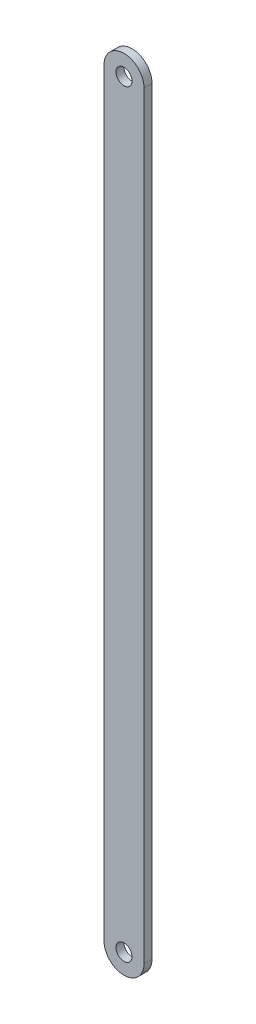
ISO-10303-21;
HEADER;
FILE_DESCRIPTION(('STEP AP214'),'2;1');
FILE_NAME('part.step','',(''),(''),'','','');
FILE_SCHEMA(('AUTOMOTIVE_DESIGN { 1 0 10303 214 1 1 1 1 }'));
ENDSEC;
DATA;
#1=APPLICATION_CONTEXT('core data for automotive mechanical design processes');
#2=APPLICATION_PROTOCOL_DEFINITION('international standard','automotive_design',2000,#1);
#3=PRODUCT_CONTEXT('',#1,'mechanical');
#4=PRODUCT('Part','Part','',(#3));
#5=PRODUCT_RELATED_PRODUCT_CATEGORY('part','',(#4));
#6=PRODUCT_DEFINITION_FORMATION('','',#4);
#7=PRODUCT_DEFINITION_CONTEXT('part definition',#1,'design');
#8=PRODUCT_DEFINITION('design','',#6,#7);
#9=PRODUCT_DEFINITION_SHAPE('','',#8);
#10=(LENGTH_UNIT() NAMED_UNIT(*) SI_UNIT(.MILLI.,.METRE.));
#11=(NAMED_UNIT(*) PLANE_ANGLE_UNIT() SI_UNIT($,.RADIAN.));
#12=(NAMED_UNIT(*) SI_UNIT($,.STERADIAN.) SOLID_ANGLE_UNIT());
#13=UNCERTAINTY_MEASURE_WITH_UNIT(LENGTH_MEASURE(1.E-05),#10,'distance_accuracy_value','');
#14=(GEOMETRIC_REPRESENTATION_CONTEXT(3) GLOBAL_UNCERTAINTY_ASSIGNED_CONTEXT((#13)) GLOBAL_UNIT_ASSIGNED_CONTEXT((#10,
#11,#12)) REPRESENTATION_CONTEXT('',''));
#15=CARTESIAN_POINT('',(0.,0.,0.));
#16=DIRECTION('',(0.,0.,1.));
#17=DIRECTION('',(1.,0.,0.));
#18=AXIS2_PLACEMENT_3D('',#15,#16,#17);
#19=CARTESIAN_POINT('',(25.,0.,10.));
#20=DIRECTION('',(0.,0.,1.));
#21=DIRECTION('',(1.,0.,0.));
#22=AXIS2_PLACEMENT_3D('',#19,#20,#21);
#23=PLANE('',#22);
#24=CARTESIAN_POINT('',(25.,945.2,10.));
#25=DIRECTION('',(0.,0.,1.));
#26=DIRECTION('',(1.,0.,0.));
#27=AXIS2_PLACEMENT_3D('',#24,#25,#26);
#28=CIRCLE('',#27,10.);
#29=CARTESIAN_POINT('',(35.,945.2,10.));
#30=VERTEX_POINT('',#29);
#31=EDGE_CURVE('E100',#30,#30,#28,.T.);
#32=ORIENTED_EDGE('',*,*,#31,.F.);
#33=EDGE_LOOP('',(#32));
#34=FACE_BOUND('',#33,.T.);
#35=CARTESIAN_POINT('',(25.,0.,10.));
#36=DIRECTION('',(0.,0.,1.));
#37=DIRECTION('',(1.,0.,0.));
#38=AXIS2_PLACEMENT_3D('',#35,#36,#37);
#39=CIRCLE('',#38,25.);
#40=CARTESIAN_POINT('',(0.,0.,10.));
#41=VERTEX_POINT('',#40);
#42=CARTESIAN_POINT('',(50.,0.,10.));
#43=VERTEX_POINT('',#42);
#44=EDGE_CURVE('E85',#41,#43,#39,.T.);
#45=ORIENTED_EDGE('',*,*,#44,.T.);
#46=DIRECTION('',(0.,1.,0.));
#47=VECTOR('',#46,1.);
#48=CARTESIAN_POINT('',(50.,0.,10.));
#49=LINE('',#48,#47);
#50=CARTESIAN_POINT('',(50.0000000000001,945.2,10.));
#51=VERTEX_POINT('',#50);
#52=EDGE_CURVE('E80',#43,#51,#49,.T.);
#53=ORIENTED_EDGE('',*,*,#52,.T.);
#54=CARTESIAN_POINT('',(25.,945.2,10.));
#55=DIRECTION('',(0.,0.,1.));
#56=DIRECTION('',(1.,0.,0.));
#57=AXIS2_PLACEMENT_3D('',#54,#55,#56);
#58=CIRCLE('',#57,25.0000000000001);
#59=CARTESIAN_POINT('',(-2.15105711021124E-13,945.2,10.));
#60=VERTEX_POINT('',#59);
#61=EDGE_CURVE('E83',#51,#60,#58,.T.);
#62=ORIENTED_EDGE('',*,*,#61,.T.);
#63=DIRECTION('',(0.,-1.,0.));
#64=VECTOR('',#63,1.);
#65=CARTESIAN_POINT('',(-2.15105711021124E-13,945.2,10.));
#66=LINE('',#65,#64);
#67=EDGE_CURVE('E50',#60,#41,#66,.T.);
#68=ORIENTED_EDGE('',*,*,#67,.T.);
#69=EDGE_LOOP('',(#45,#53,#62,#68));
#70=FACE_BOUND('',#69,.T.);
#71=CARTESIAN_POINT('',(25.,0.,10.));
#72=DIRECTION('',(0.,0.,1.));
#73=DIRECTION('',(1.,0.,0.));
#74=AXIS2_PLACEMENT_3D('',#71,#72,#73);
#75=CIRCLE('',#74,10.);
#76=CARTESIAN_POINT('',(35.,0.,10.));
#77=VERTEX_POINT('',#76);
#78=EDGE_CURVE('E115',#77,#77,#75,.T.);
#79=ORIENTED_EDGE('',*,*,#78,.F.);
#80=EDGE_LOOP('',(#79));
#81=FACE_BOUND('',#80,.T.);
#82=ADVANCED_FACE('F33',(#34,#70,#81),#23,.T.);
#83=CARTESIAN_POINT('',(25.,0.,0.));
#84=DIRECTION('',(0.,0.,1.));
#85=DIRECTION('',(1.,0.,0.));
#86=AXIS2_PLACEMENT_3D('',#83,#84,#85);
#87=PLANE('',#86);
#88=CARTESIAN_POINT('',(25.,945.2,0.));
#89=DIRECTION('',(0.,0.,1.));
#90=DIRECTION('',(1.,0.,0.));
#91=AXIS2_PLACEMENT_3D('',#88,#89,#90);
#92=CIRCLE('',#91,10.);
#93=CARTESIAN_POINT('',(35.,945.2,0.));
#94=VERTEX_POINT('',#93);
#95=EDGE_CURVE('E112',#94,#94,#92,.T.);
#96=ORIENTED_EDGE('',*,*,#95,.T.);
#97=EDGE_LOOP('',(#96));
#98=FACE_BOUND('',#97,.T.);
#99=CARTESIAN_POINT('',(25.,0.,0.));
#100=DIRECTION('',(0.,0.,1.));
#101=DIRECTION('',(1.,0.,0.));
#102=AXIS2_PLACEMENT_3D('',#99,#100,#101);
#103=CIRCLE('',#102,25.);
#104=CARTESIAN_POINT('',(0.,0.,0.));
#105=VERTEX_POINT('',#104);
#106=CARTESIAN_POINT('',(50.,0.,0.));
#107=VERTEX_POINT('',#106);
#108=EDGE_CURVE('E97',#105,#107,#103,.T.);
#109=ORIENTED_EDGE('',*,*,#108,.F.);
#110=DIRECTION('',(0.,-1.,0.));
#111=VECTOR('',#110,1.);
#112=CARTESIAN_POINT('',(-2.15105711021124E-13,945.2,0.));
#113=LINE('',#112,#111);
#114=CARTESIAN_POINT('',(-2.15105711021124E-13,945.2,0.));
#115=VERTEX_POINT('',#114);
#116=EDGE_CURVE('E73',#115,#105,#113,.T.);
#117=ORIENTED_EDGE('',*,*,#116,.F.);
#118=CARTESIAN_POINT('',(25.,945.2,0.));
#119=DIRECTION('',(0.,0.,1.));
#120=DIRECTION('',(1.,0.,0.));
#121=AXIS2_PLACEMENT_3D('',#118,#119,#120);
#122=CIRCLE('',#121,25.0000000000001);
#123=CARTESIAN_POINT('',(50.0000000000001,945.2,0.));
#124=VERTEX_POINT('',#123);
#125=EDGE_CURVE('E67',#124,#115,#122,.T.);
#126=ORIENTED_EDGE('',*,*,#125,.F.);
#127=DIRECTION('',(0.,1.,0.));
#128=VECTOR('',#127,1.);
#129=CARTESIAN_POINT('',(50.,0.,0.));
#130=LINE('',#129,#128);
#131=EDGE_CURVE('E89',#107,#124,#130,.T.);
#132=ORIENTED_EDGE('',*,*,#131,.F.);
#133=EDGE_LOOP('',(#109,#117,#126,#132));
#134=FACE_BOUND('',#133,.T.);
#135=CARTESIAN_POINT('',(25.,0.,0.));
#136=DIRECTION('',(0.,0.,1.));
#137=DIRECTION('',(1.,0.,0.));
#138=AXIS2_PLACEMENT_3D('',#135,#136,#137);
#139=CIRCLE('',#138,10.);
#140=CARTESIAN_POINT('',(35.,0.,0.));
#141=VERTEX_POINT('',#140);
#142=EDGE_CURVE('E118',#141,#141,#139,.T.);
#143=ORIENTED_EDGE('',*,*,#142,.T.);
#144=EDGE_LOOP('',(#143));
#145=FACE_BOUND('',#144,.T.);
#146=ADVANCED_FACE('F108',(#98,#134,#145),#87,.F.);
#147=CARTESIAN_POINT('',(25.,0.,10.));
#148=DIRECTION('',(0.,0.,-1.));
#149=DIRECTION('',(-1.,0.,0.));
#150=AXIS2_PLACEMENT_3D('',#147,#148,#149);
#151=CYLINDRICAL_SURFACE('',#150,25.);
#152=ORIENTED_EDGE('',*,*,#108,.T.);
#153=DIRECTION('',(0.,0.,-1.));
#154=VECTOR('',#153,1.);
#155=CARTESIAN_POINT('',(50.,0.,10.));
#156=LINE('',#155,#154);
#157=EDGE_CURVE('E11',#43,#107,#156,.T.);
#158=ORIENTED_EDGE('',*,*,#157,.F.);
#159=ORIENTED_EDGE('',*,*,#44,.F.);
#160=DIRECTION('',(0.,0.,-1.));
#161=VECTOR('',#160,1.);
#162=CARTESIAN_POINT('',(0.,0.,10.));
#163=LINE('',#162,#161);
#164=EDGE_CURVE('E93',#41,#105,#163,.T.);
#165=ORIENTED_EDGE('',*,*,#164,.T.);
#166=EDGE_LOOP('',(#152,#158,#159,#165));
#167=FACE_BOUND('',#166,.T.);
#168=ADVANCED_FACE('F35',(#167),#151,.T.);
#169=CARTESIAN_POINT('',(50.,0.,10.));
#170=DIRECTION('',(-1.,0.,0.));
#171=DIRECTION('',(0.,-1.,0.));
#172=AXIS2_PLACEMENT_3D('',#169,#170,#171);
#173=PLANE('',#172);
#174=ORIENTED_EDGE('',*,*,#131,.T.);
#175=DIRECTION('',(0.,0.,-1.));
#176=VECTOR('',#175,1.);
#177=CARTESIAN_POINT('',(50.0000000000001,945.2,10.));
#178=LINE('',#177,#176);
#179=EDGE_CURVE('E42',#51,#124,#178,.T.);
#180=ORIENTED_EDGE('',*,*,#179,.F.);
#181=ORIENTED_EDGE('',*,*,#52,.F.);
#182=ORIENTED_EDGE('',*,*,#157,.T.);
#183=EDGE_LOOP('',(#174,#180,#181,#182));
#184=FACE_BOUND('',#183,.T.);
#185=ADVANCED_FACE('F88',(#184),#173,.F.);
#186=CARTESIAN_POINT('',(25.,945.2,10.));
#187=DIRECTION('',(0.,0.,-1.));
#188=DIRECTION('',(-1.,0.,0.));
#189=AXIS2_PLACEMENT_3D('',#186,#187,#188);
#190=CYLINDRICAL_SURFACE('',#189,25.0000000000001);
#191=ORIENTED_EDGE('',*,*,#125,.T.);
#192=DIRECTION('',(0.,0.,-1.));
#193=VECTOR('',#192,1.);
#194=CARTESIAN_POINT('',(-2.15105711021124E-13,945.2,10.));
#195=LINE('',#194,#193);
#196=EDGE_CURVE('E90',#60,#115,#195,.T.);
#197=ORIENTED_EDGE('',*,*,#196,.F.);
#198=ORIENTED_EDGE('',*,*,#61,.F.);
#199=ORIENTED_EDGE('',*,*,#179,.T.);
#200=EDGE_LOOP('',(#191,#197,#198,#199));
#201=FACE_BOUND('',#200,.T.);
#202=ADVANCED_FACE('F91',(#201),#190,.T.);
#203=CARTESIAN_POINT('',(-2.15105711021124E-13,945.2,10.));
#204=DIRECTION('',(1.,0.,0.));
#205=DIRECTION('',(0.,1.,0.));
#206=AXIS2_PLACEMENT_3D('',#203,#204,#205);
#207=PLANE('',#206);
#208=ORIENTED_EDGE('',*,*,#116,.T.);
#209=ORIENTED_EDGE('',*,*,#164,.F.);
#210=ORIENTED_EDGE('',*,*,#67,.F.);
#211=ORIENTED_EDGE('',*,*,#196,.T.);
#212=EDGE_LOOP('',(#208,#209,#210,#211));
#213=FACE_BOUND('',#212,.T.);
#214=ADVANCED_FACE('F105',(#213),#207,.F.);
#215=CARTESIAN_POINT('',(25.,945.2,10.));
#216=DIRECTION('',(0.,0.,-1.));
#217=DIRECTION('',(-1.,0.,0.));
#218=AXIS2_PLACEMENT_3D('',#215,#216,#217);
#219=CYLINDRICAL_SURFACE('',#218,10.);
#220=ORIENTED_EDGE('',*,*,#31,.T.);
#221=EDGE_LOOP('',(#220));
#222=FACE_BOUND('',#221,.T.);
#223=ORIENTED_EDGE('',*,*,#95,.F.);
#224=EDGE_LOOP('',(#223));
#225=FACE_BOUND('',#224,.T.);
#226=ADVANCED_FACE('F136',(#222,#225),#219,.F.);
#227=CARTESIAN_POINT('',(25.,0.,10.));
#228=DIRECTION('',(0.,0.,-1.));
#229=DIRECTION('',(-1.,0.,0.));
#230=AXIS2_PLACEMENT_3D('',#227,#228,#229);
#231=CYLINDRICAL_SURFACE('',#230,10.);
#232=ORIENTED_EDGE('',*,*,#78,.T.);
#233=EDGE_LOOP('',(#232));
#234=FACE_BOUND('',#233,.T.);
#235=ORIENTED_EDGE('',*,*,#142,.F.);
#236=EDGE_LOOP('',(#235));
#237=FACE_BOUND('',#236,.T.);
#238=ADVANCED_FACE('F124',(#234,#237),#231,.F.);
#239=CLOSED_SHELL('',(#82,#146,#168,#185,#202,#214,#226,#238));
#240=MANIFOLD_SOLID_BREP('B2',#239);
#241=ADVANCED_BREP_SHAPE_REPRESENTATION('',(#18,#240),#14);
#242=SHAPE_DEFINITION_REPRESENTATION(#9,#241);
ENDSEC;
END-ISO-10303-21;
